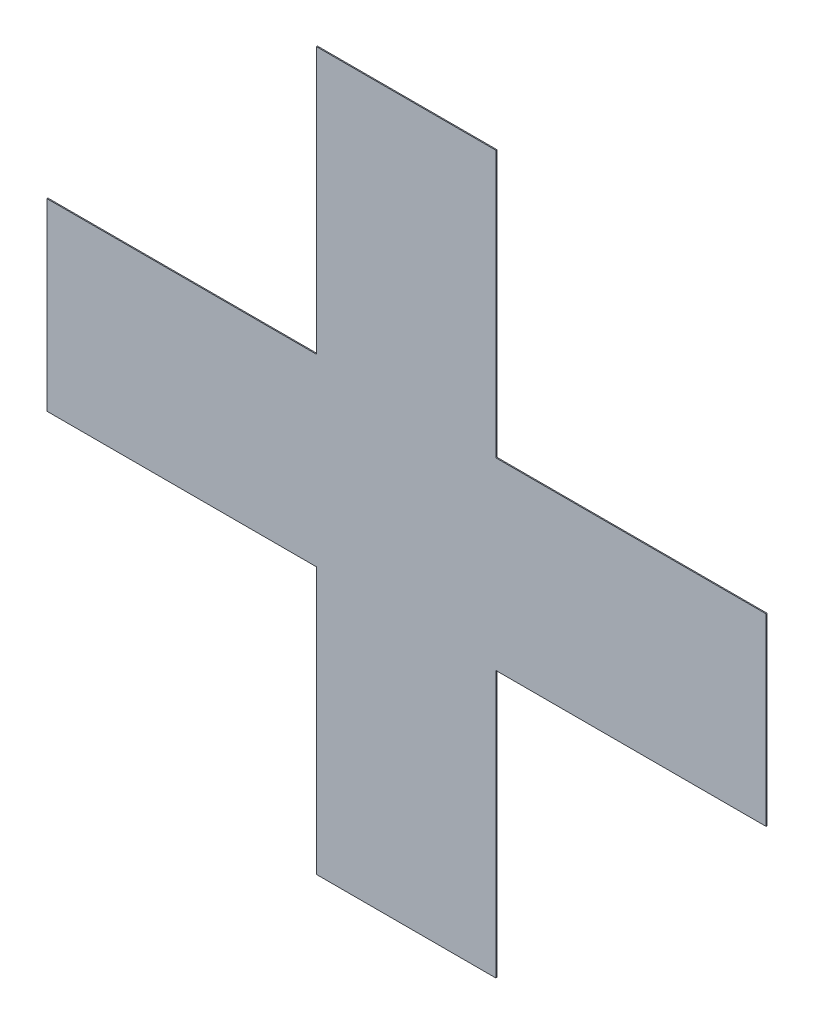
ISO-10303-21;
HEADER;
FILE_DESCRIPTION(('STEP AP214'),'2;1');
FILE_NAME('part.step','',(''),(''),'','','');
FILE_SCHEMA(('AUTOMOTIVE_DESIGN { 1 0 10303 214 1 1 1 1 }'));
ENDSEC;
DATA;
#1=APPLICATION_CONTEXT('core data for automotive mechanical design processes');
#2=APPLICATION_PROTOCOL_DEFINITION('international standard','automotive_design',2000,#1);
#3=PRODUCT_CONTEXT('',#1,'mechanical');
#4=PRODUCT('Part','Part','',(#3));
#5=PRODUCT_RELATED_PRODUCT_CATEGORY('part','',(#4));
#6=PRODUCT_DEFINITION_FORMATION('','',#4);
#7=PRODUCT_DEFINITION_CONTEXT('part definition',#1,'design');
#8=PRODUCT_DEFINITION('design','',#6,#7);
#9=PRODUCT_DEFINITION_SHAPE('','',#8);
#10=(LENGTH_UNIT() NAMED_UNIT(*) SI_UNIT(.MILLI.,.METRE.));
#11=(NAMED_UNIT(*) PLANE_ANGLE_UNIT() SI_UNIT($,.RADIAN.));
#12=(NAMED_UNIT(*) SI_UNIT($,.STERADIAN.) SOLID_ANGLE_UNIT());
#13=UNCERTAINTY_MEASURE_WITH_UNIT(LENGTH_MEASURE(1.E-05),#10,'distance_accuracy_value','');
#14=(GEOMETRIC_REPRESENTATION_CONTEXT(3) GLOBAL_UNCERTAINTY_ASSIGNED_CONTEXT((#13)) GLOBAL_UNIT_ASSIGNED_CONTEXT((#10,
#11,#12)) REPRESENTATION_CONTEXT('',''));
#15=CARTESIAN_POINT('',(0.,0.,0.));
#16=DIRECTION('',(0.,0.,1.));
#17=DIRECTION('',(1.,0.,0.));
#18=AXIS2_PLACEMENT_3D('',#15,#16,#17);
#19=CARTESIAN_POINT('',(-3.49450233484993,6.3894008192784,5.));
#20=DIRECTION('',(0.,-1.,0.));
#21=DIRECTION('',(1.,0.,0.));
#22=AXIS2_PLACEMENT_3D('',#19,#20,#21);
#23=PLANE('',#22);
#24=DIRECTION('',(1.,0.,0.));
#25=VECTOR('',#24,1.);
#26=CARTESIAN_POINT('',(-3.05624013972798,6.3894008192784,5.005));
#27=LINE('',#26,#25);
#28=CARTESIAN_POINT('',(-3.49450233484993,6.3894008192784,5.005));
#29=VERTEX_POINT('',#28);
#30=CARTESIAN_POINT('',(-2.62178892021578,6.3894008192784,5.005));
#31=VERTEX_POINT('',#30);
#32=EDGE_CURVE('E243',#29,#31,#27,.T.);
#33=ORIENTED_EDGE('',*,*,#32,.F.);
#34=DIRECTION('',(0.,0.,1.));
#35=VECTOR('',#34,1.);
#36=CARTESIAN_POINT('',(-3.49450233484993,6.3894008192784,5.0025));
#37=LINE('',#36,#35);
#38=CARTESIAN_POINT('',(-3.49450233484993,6.3894008192784,5.));
#39=VERTEX_POINT('',#38);
#40=EDGE_CURVE('E161',#39,#29,#37,.T.);
#41=ORIENTED_EDGE('',*,*,#40,.F.);
#42=DIRECTION('',(-1.,0.,0.));
#43=VECTOR('',#42,1.);
#44=CARTESIAN_POINT('',(-3.05624013972798,6.3894008192784,5.));
#45=LINE('',#44,#43);
#46=CARTESIAN_POINT('',(-2.62178892021578,6.3894008192784,5.));
#47=VERTEX_POINT('',#46);
#48=EDGE_CURVE('E160',#47,#39,#45,.T.);
#49=ORIENTED_EDGE('',*,*,#48,.F.);
#50=DIRECTION('',(0.,0.,-1.));
#51=VECTOR('',#50,1.);
#52=CARTESIAN_POINT('',(-2.62178892021578,6.3894008192784,5.0025));
#53=LINE('',#52,#51);
#54=EDGE_CURVE('E21',#31,#47,#53,.T.);
#55=ORIENTED_EDGE('',*,*,#54,.F.);
#56=EDGE_LOOP('',(#33,#41,#49,#55));
#57=FACE_BOUND('',#56,.T.);
#58=ADVANCED_FACE('F17',(#57),#23,.T.);
#59=CARTESIAN_POINT('',(-2.62178892021578,6.3894008192784,5.));
#60=DIRECTION('',(1.,0.,0.));
#61=DIRECTION('',(0.,1.,0.));
#62=AXIS2_PLACEMENT_3D('',#59,#60,#61);
#63=PLANE('',#62);
#64=DIRECTION('',(0.,1.,0.));
#65=VECTOR('',#64,1.);
#66=CARTESIAN_POINT('',(-2.62178892021578,8.13292216074182,5.005));
#67=LINE('',#66,#65);
#68=CARTESIAN_POINT('',(-2.62178892021578,7.68513252659547,5.005));
#69=VERTEX_POINT('',#68);
#70=EDGE_CURVE('E155',#31,#69,#67,.T.);
#71=ORIENTED_EDGE('',*,*,#70,.F.);
#72=ORIENTED_EDGE('',*,*,#54,.T.);
#73=DIRECTION('',(0.,-1.,0.));
#74=VECTOR('',#73,1.);
#75=CARTESIAN_POINT('',(-2.62178892021578,8.13292216074182,5.));
#76=LINE('',#75,#74);
#77=CARTESIAN_POINT('',(-2.62178892021578,7.68513252659547,5.));
#78=VERTEX_POINT('',#77);
#79=EDGE_CURVE('E152',#78,#47,#76,.T.);
#80=ORIENTED_EDGE('',*,*,#79,.F.);
#81=DIRECTION('',(0.,0.,-1.));
#82=VECTOR('',#81,1.);
#83=CARTESIAN_POINT('',(-2.62178892021578,7.68513252659547,5.0025));
#84=LINE('',#83,#82);
#85=EDGE_CURVE('E143',#69,#78,#84,.T.);
#86=ORIENTED_EDGE('',*,*,#85,.F.);
#87=EDGE_LOOP('',(#71,#72,#80,#86));
#88=FACE_BOUND('',#87,.T.);
#89=ADVANCED_FACE('F151',(#88),#63,.T.);
#90=CARTESIAN_POINT('',(-2.62178892021578,7.68513252659547,5.));
#91=DIRECTION('',(0.,-1.,0.));
#92=DIRECTION('',(1.,0.,0.));
#93=AXIS2_PLACEMENT_3D('',#90,#91,#92);
#94=PLANE('',#93);
#95=DIRECTION('',(1.,0.,0.));
#96=VECTOR('',#95,1.);
#97=CARTESIAN_POINT('',(-3.05624013972798,7.68513252659547,5.005));
#98=LINE('',#97,#96);
#99=CARTESIAN_POINT('',(-1.30700233484993,7.68513252659547,5.005));
#100=VERTEX_POINT('',#99);
#101=EDGE_CURVE('E202',#69,#100,#98,.T.);
#102=ORIENTED_EDGE('',*,*,#101,.F.);
#103=ORIENTED_EDGE('',*,*,#85,.T.);
#104=DIRECTION('',(-1.,0.,0.));
#105=VECTOR('',#104,1.);
#106=CARTESIAN_POINT('',(-3.05624013972798,7.68513252659547,5.));
#107=LINE('',#106,#105);
#108=CARTESIAN_POINT('',(-1.30700233484993,7.68513252659547,5.));
#109=VERTEX_POINT('',#108);
#110=EDGE_CURVE('E166',#109,#78,#107,.T.);
#111=ORIENTED_EDGE('',*,*,#110,.F.);
#112=DIRECTION('',(0.,0.,-1.));
#113=VECTOR('',#112,1.);
#114=CARTESIAN_POINT('',(-1.30700233484993,7.68513252659547,5.0025));
#115=LINE('',#114,#113);
#116=EDGE_CURVE('E142',#100,#109,#115,.T.);
#117=ORIENTED_EDGE('',*,*,#116,.F.);
#118=EDGE_LOOP('',(#102,#103,#111,#117));
#119=FACE_BOUND('',#118,.T.);
#120=ADVANCED_FACE('F201',(#119),#94,.T.);
#121=CARTESIAN_POINT('',(-1.30700233484993,7.68513252659547,5.));
#122=DIRECTION('',(1.,0.,0.));
#123=DIRECTION('',(0.,1.,0.));
#124=AXIS2_PLACEMENT_3D('',#121,#122,#123);
#125=PLANE('',#124);
#126=DIRECTION('',(0.,1.,0.));
#127=VECTOR('',#126,1.);
#128=CARTESIAN_POINT('',(-1.30700233484993,8.13292216074182,5.005));
#129=LINE('',#128,#127);
#130=CARTESIAN_POINT('',(-1.30700233484993,8.58071179488816,5.005));
#131=VERTEX_POINT('',#130);
#132=EDGE_CURVE('E199',#100,#131,#129,.T.);
#133=ORIENTED_EDGE('',*,*,#132,.F.);
#134=ORIENTED_EDGE('',*,*,#116,.T.);
#135=DIRECTION('',(0.,-1.,0.));
#136=VECTOR('',#135,1.);
#137=CARTESIAN_POINT('',(-1.30700233484993,8.13292216074182,5.));
#138=LINE('',#137,#136);
#139=CARTESIAN_POINT('',(-1.30700233484993,8.58071179488816,5.));
#140=VERTEX_POINT('',#139);
#141=EDGE_CURVE('E168',#140,#109,#138,.T.);
#142=ORIENTED_EDGE('',*,*,#141,.F.);
#143=DIRECTION('',(0.,0.,-1.));
#144=VECTOR('',#143,1.);
#145=CARTESIAN_POINT('',(-1.30700233484993,8.58071179488816,5.0025));
#146=LINE('',#145,#144);
#147=EDGE_CURVE('E140',#131,#140,#146,.T.);
#148=ORIENTED_EDGE('',*,*,#147,.F.);
#149=EDGE_LOOP('',(#133,#134,#142,#148));
#150=FACE_BOUND('',#149,.T.);
#151=ADVANCED_FACE('F197',(#150),#125,.T.);
#152=CARTESIAN_POINT('',(-1.30700233484993,8.58071179488816,5.));
#153=DIRECTION('',(0.,1.,0.));
#154=DIRECTION('',(-1.,0.,0.));
#155=AXIS2_PLACEMENT_3D('',#152,#153,#154);
#156=PLANE('',#155);
#157=DIRECTION('',(-1.,0.,0.));
#158=VECTOR('',#157,1.);
#159=CARTESIAN_POINT('',(-3.05624013972798,8.58071179488816,5.005));
#160=LINE('',#159,#158);
#161=CARTESIAN_POINT('',(-2.62178892021578,8.58071179488816,5.005));
#162=VERTEX_POINT('',#161);
#163=EDGE_CURVE('E238',#131,#162,#160,.T.);
#164=ORIENTED_EDGE('',*,*,#163,.F.);
#165=ORIENTED_EDGE('',*,*,#147,.T.);
#166=DIRECTION('',(1.,0.,0.));
#167=VECTOR('',#166,1.);
#168=CARTESIAN_POINT('',(-3.05624013972798,8.58071179488816,5.));
#169=LINE('',#168,#167);
#170=CARTESIAN_POINT('',(-2.62178892021578,8.58071179488816,5.));
#171=VERTEX_POINT('',#170);
#172=EDGE_CURVE('E173',#171,#140,#169,.T.);
#173=ORIENTED_EDGE('',*,*,#172,.F.);
#174=DIRECTION('',(0.,0.,-1.));
#175=VECTOR('',#174,1.);
#176=CARTESIAN_POINT('',(-2.62178892021578,8.58071179488816,5.0025));
#177=LINE('',#176,#175);
#178=EDGE_CURVE('E138',#162,#171,#177,.T.);
#179=ORIENTED_EDGE('',*,*,#178,.F.);
#180=EDGE_LOOP('',(#164,#165,#173,#179));
#181=FACE_BOUND('',#180,.T.);
#182=ADVANCED_FACE('F193',(#181),#156,.T.);
#183=CARTESIAN_POINT('',(-2.62178892021578,8.58071179488816,5.));
#184=DIRECTION('',(1.,0.,0.));
#185=DIRECTION('',(0.,1.,0.));
#186=AXIS2_PLACEMENT_3D('',#183,#184,#185);
#187=PLANE('',#186);
#188=DIRECTION('',(0.,1.,0.));
#189=VECTOR('',#188,1.);
#190=CARTESIAN_POINT('',(-2.62178892021578,8.13292216074182,5.005));
#191=LINE('',#190,#189);
#192=CARTESIAN_POINT('',(-2.62178892021578,9.87644350220523,5.005));
#193=VERTEX_POINT('',#192);
#194=EDGE_CURVE('E189',#162,#193,#191,.T.);
#195=ORIENTED_EDGE('',*,*,#194,.F.);
#196=ORIENTED_EDGE('',*,*,#178,.T.);
#197=DIRECTION('',(0.,-1.,0.));
#198=VECTOR('',#197,1.);
#199=CARTESIAN_POINT('',(-2.62178892021578,8.13292216074182,5.));
#200=LINE('',#199,#198);
#201=CARTESIAN_POINT('',(-2.62178892021578,9.87644350220523,5.));
#202=VERTEX_POINT('',#201);
#203=EDGE_CURVE('E176',#202,#171,#200,.T.);
#204=ORIENTED_EDGE('',*,*,#203,.F.);
#205=DIRECTION('',(0.,0.,-1.));
#206=VECTOR('',#205,1.);
#207=CARTESIAN_POINT('',(-2.62178892021578,9.87644350220523,5.0025));
#208=LINE('',#207,#206);
#209=EDGE_CURVE('E136',#193,#202,#208,.T.);
#210=ORIENTED_EDGE('',*,*,#209,.F.);
#211=EDGE_LOOP('',(#195,#196,#204,#210));
#212=FACE_BOUND('',#211,.T.);
#213=ADVANCED_FACE('F187',(#212),#187,.T.);
#214=CARTESIAN_POINT('',(-2.62178892021578,9.87644350220523,5.));
#215=DIRECTION('',(0.,1.,0.));
#216=DIRECTION('',(-1.,0.,0.));
#217=AXIS2_PLACEMENT_3D('',#214,#215,#216);
#218=PLANE('',#217);
#219=DIRECTION('',(-1.,0.,0.));
#220=VECTOR('',#219,1.);
#221=CARTESIAN_POINT('',(-3.05624013972798,9.87644350220523,5.005));
#222=LINE('',#221,#220);
#223=CARTESIAN_POINT('',(-3.49450233484993,9.87644350220523,5.005));
#224=VERTEX_POINT('',#223);
#225=EDGE_CURVE('E183',#193,#224,#222,.T.);
#226=ORIENTED_EDGE('',*,*,#225,.F.);
#227=ORIENTED_EDGE('',*,*,#209,.T.);
#228=DIRECTION('',(1.,0.,0.));
#229=VECTOR('',#228,1.);
#230=CARTESIAN_POINT('',(-3.05624013972798,9.87644350220523,5.));
#231=LINE('',#230,#229);
#232=CARTESIAN_POINT('',(-3.49450233484993,9.87644350220523,5.));
#233=VERTEX_POINT('',#232);
#234=EDGE_CURVE('E125',#233,#202,#231,.T.);
#235=ORIENTED_EDGE('',*,*,#234,.F.);
#236=DIRECTION('',(0.,0.,-1.));
#237=VECTOR('',#236,1.);
#238=CARTESIAN_POINT('',(-3.49450233484993,9.87644350220523,5.0025));
#239=LINE('',#238,#237);
#240=EDGE_CURVE('E105',#224,#233,#239,.T.);
#241=ORIENTED_EDGE('',*,*,#240,.F.);
#242=EDGE_LOOP('',(#226,#227,#235,#241));
#243=FACE_BOUND('',#242,.T.);
#244=ADVANCED_FACE('F181',(#243),#218,.T.);
#245=CARTESIAN_POINT('',(-3.49450233484993,9.87644350220523,5.));
#246=DIRECTION('',(-1.,0.,0.));
#247=DIRECTION('',(0.,-1.,0.));
#248=AXIS2_PLACEMENT_3D('',#245,#246,#247);
#249=PLANE('',#248);
#250=DIRECTION('',(0.,-1.,0.));
#251=VECTOR('',#250,1.);
#252=CARTESIAN_POINT('',(-3.49450233484993,8.13292216074182,5.005));
#253=LINE('',#252,#251);
#254=CARTESIAN_POINT('',(-3.49450233484993,8.58071179488815,5.005));
#255=VERTEX_POINT('',#254);
#256=EDGE_CURVE('E234',#224,#255,#253,.T.);
#257=ORIENTED_EDGE('',*,*,#256,.F.);
#258=ORIENTED_EDGE('',*,*,#240,.T.);
#259=DIRECTION('',(0.,1.,0.));
#260=VECTOR('',#259,1.);
#261=CARTESIAN_POINT('',(-3.49450233484993,8.13292216074182,5.));
#262=LINE('',#261,#260);
#263=CARTESIAN_POINT('',(-3.49450233484993,8.58071179488816,5.));
#264=VERTEX_POINT('',#263);
#265=EDGE_CURVE('E121',#264,#233,#262,.T.);
#266=ORIENTED_EDGE('',*,*,#265,.F.);
#267=DIRECTION('',(0.,0.,-1.));
#268=VECTOR('',#267,1.);
#269=CARTESIAN_POINT('',(-3.49450233484993,8.58071179488816,5.0025));
#270=LINE('',#269,#268);
#271=EDGE_CURVE('E111',#255,#264,#270,.T.);
#272=ORIENTED_EDGE('',*,*,#271,.F.);
#273=EDGE_LOOP('',(#257,#258,#266,#272));
#274=FACE_BOUND('',#273,.T.);
#275=ADVANCED_FACE('F122',(#274),#249,.T.);
#276=CARTESIAN_POINT('',(-3.49450233484993,8.58071179488816,5.));
#277=DIRECTION('',(0.,1.,0.));
#278=DIRECTION('',(-1.,0.,0.));
#279=AXIS2_PLACEMENT_3D('',#276,#277,#278);
#280=PLANE('',#279);
#281=DIRECTION('',(-1.,0.,0.));
#282=VECTOR('',#281,1.);
#283=CARTESIAN_POINT('',(-3.05624013972798,8.58071179488816,5.005));
#284=LINE('',#283,#282);
#285=CARTESIAN_POINT('',(-4.80547794460603,8.58071179488816,5.005));
#286=VERTEX_POINT('',#285);
#287=EDGE_CURVE('E116',#255,#286,#284,.T.);
#288=ORIENTED_EDGE('',*,*,#287,.F.);
#289=ORIENTED_EDGE('',*,*,#271,.T.);
#290=DIRECTION('',(1.,0.,0.));
#291=VECTOR('',#290,1.);
#292=CARTESIAN_POINT('',(-3.05624013972798,8.58071179488816,5.));
#293=LINE('',#292,#291);
#294=CARTESIAN_POINT('',(-4.80547794460603,8.58071179488816,5.));
#295=VERTEX_POINT('',#294);
#296=EDGE_CURVE('E114',#295,#264,#293,.T.);
#297=ORIENTED_EDGE('',*,*,#296,.F.);
#298=DIRECTION('',(0.,0.,1.));
#299=VECTOR('',#298,1.);
#300=CARTESIAN_POINT('',(-4.80547794460603,8.58071179488816,5.0025));
#301=LINE('',#300,#299);
#302=EDGE_CURVE('E118',#295,#286,#301,.T.);
#303=ORIENTED_EDGE('',*,*,#302,.T.);
#304=EDGE_LOOP('',(#288,#289,#297,#303));
#305=FACE_BOUND('',#304,.T.);
#306=ADVANCED_FACE('F112',(#305),#280,.T.);
#307=CARTESIAN_POINT('',(-1.30700233484993,6.3894008192784,5.));
#308=DIRECTION('',(0.,0.,-1.));
#309=DIRECTION('',(-1.,0.,0.));
#310=AXIS2_PLACEMENT_3D('',#307,#308,#309);
#311=PLANE('',#310);
#312=ORIENTED_EDGE('',*,*,#79,.T.);
#313=ORIENTED_EDGE('',*,*,#48,.T.);
#314=DIRECTION('',(0.,-1.,0.));
#315=VECTOR('',#314,1.);
#316=CARTESIAN_POINT('',(-3.49450233484993,7.03726667293693,5.));
#317=LINE('',#316,#315);
#318=CARTESIAN_POINT('',(-3.49450233484993,7.68513252659547,5.));
#319=VERTEX_POINT('',#318);
#320=EDGE_CURVE('E163',#319,#39,#317,.T.);
#321=ORIENTED_EDGE('',*,*,#320,.F.);
#322=DIRECTION('',(1.,0.,0.));
#323=VECTOR('',#322,1.);
#324=CARTESIAN_POINT('',(-4.14999013972798,7.68513252659547,5.));
#325=LINE('',#324,#323);
#326=CARTESIAN_POINT('',(-4.80547794460603,7.68513252659547,5.));
#327=VERTEX_POINT('',#326);
#328=EDGE_CURVE('E227',#327,#319,#325,.T.);
#329=ORIENTED_EDGE('',*,*,#328,.F.);
#330=DIRECTION('',(0.,-1.,0.));
#331=VECTOR('',#330,1.);
#332=CARTESIAN_POINT('',(-4.80547794460603,8.13292216074182,5.));
#333=LINE('',#332,#331);
#334=EDGE_CURVE('E130',#295,#327,#333,.T.);
#335=ORIENTED_EDGE('',*,*,#334,.F.);
#336=ORIENTED_EDGE('',*,*,#296,.T.);
#337=ORIENTED_EDGE('',*,*,#265,.T.);
#338=ORIENTED_EDGE('',*,*,#234,.T.);
#339=ORIENTED_EDGE('',*,*,#203,.T.);
#340=ORIENTED_EDGE('',*,*,#172,.T.);
#341=ORIENTED_EDGE('',*,*,#141,.T.);
#342=ORIENTED_EDGE('',*,*,#110,.T.);
#343=EDGE_LOOP('',(#312,#313,#321,#329,#335,#336,#337,#338,#339,#340,#341,#342));
#344=FACE_BOUND('',#343,.T.);
#345=ADVANCED_FACE('F128',(#344),#311,.T.);
#346=CARTESIAN_POINT('',(-3.49450233484993,7.68513252659547,5.));
#347=DIRECTION('',(-1.,0.,0.));
#348=DIRECTION('',(0.,-1.,0.));
#349=AXIS2_PLACEMENT_3D('',#346,#347,#348);
#350=PLANE('',#349);
#351=DIRECTION('',(0.,-1.,0.));
#352=VECTOR('',#351,1.);
#353=CARTESIAN_POINT('',(-3.49450233484993,8.13292216074182,5.005));
#354=LINE('',#353,#352);
#355=CARTESIAN_POINT('',(-3.49450233484993,7.68513252659547,5.005));
#356=VERTEX_POINT('',#355);
#357=EDGE_CURVE('E245',#356,#29,#354,.T.);
#358=ORIENTED_EDGE('',*,*,#357,.F.);
#359=DIRECTION('',(0.,0.,1.));
#360=VECTOR('',#359,1.);
#361=CARTESIAN_POINT('',(-3.49450233484993,7.68513252659547,5.0025));
#362=LINE('',#361,#360);
#363=EDGE_CURVE('E224',#319,#356,#362,.T.);
#364=ORIENTED_EDGE('',*,*,#363,.F.);
#365=ORIENTED_EDGE('',*,*,#320,.T.);
#366=ORIENTED_EDGE('',*,*,#40,.T.);
#367=EDGE_LOOP('',(#358,#364,#365,#366));
#368=FACE_BOUND('',#367,.T.);
#369=ADVANCED_FACE('F248',(#368),#350,.T.);
#370=CARTESIAN_POINT('',(-4.80547794460603,6.3894008192784,5.005));
#371=DIRECTION('',(0.,0.,1.));
#372=DIRECTION('',(1.,0.,0.));
#373=AXIS2_PLACEMENT_3D('',#370,#371,#372);
#374=PLANE('',#373);
#375=DIRECTION('',(0.,1.,0.));
#376=VECTOR('',#375,1.);
#377=CARTESIAN_POINT('',(-4.80547794460603,8.13292216074182,5.005));
#378=LINE('',#377,#376);
#379=CARTESIAN_POINT('',(-4.80547794460603,7.68513252659547,5.005));
#380=VERTEX_POINT('',#379);
#381=EDGE_CURVE('E36',#380,#286,#378,.T.);
#382=ORIENTED_EDGE('',*,*,#381,.F.);
#383=DIRECTION('',(-1.,0.,0.));
#384=VECTOR('',#383,1.);
#385=CARTESIAN_POINT('',(-4.14999013972798,7.68513252659547,5.005));
#386=LINE('',#385,#384);
#387=EDGE_CURVE('E27',#356,#380,#386,.T.);
#388=ORIENTED_EDGE('',*,*,#387,.F.);
#389=ORIENTED_EDGE('',*,*,#357,.T.);
#390=ORIENTED_EDGE('',*,*,#32,.T.);
#391=ORIENTED_EDGE('',*,*,#70,.T.);
#392=ORIENTED_EDGE('',*,*,#101,.T.);
#393=ORIENTED_EDGE('',*,*,#132,.T.);
#394=ORIENTED_EDGE('',*,*,#163,.T.);
#395=ORIENTED_EDGE('',*,*,#194,.T.);
#396=ORIENTED_EDGE('',*,*,#225,.T.);
#397=ORIENTED_EDGE('',*,*,#256,.T.);
#398=ORIENTED_EDGE('',*,*,#287,.T.);
#399=EDGE_LOOP('',(#382,#388,#389,#390,#391,#392,#393,#394,#395,#396,#397,#398));
#400=FACE_BOUND('',#399,.T.);
#401=ADVANCED_FACE('F218',(#400),#374,.T.);
#402=CARTESIAN_POINT('',(-4.80547794460603,8.58071179488816,5.));
#403=DIRECTION('',(-1.,0.,0.));
#404=DIRECTION('',(0.,-1.,0.));
#405=AXIS2_PLACEMENT_3D('',#402,#403,#404);
#406=PLANE('',#405);
#407=ORIENTED_EDGE('',*,*,#381,.T.);
#408=ORIENTED_EDGE('',*,*,#302,.F.);
#409=ORIENTED_EDGE('',*,*,#334,.T.);
#410=DIRECTION('',(0.,0.,-1.));
#411=VECTOR('',#410,1.);
#412=CARTESIAN_POINT('',(-4.80547794460603,7.68513252659547,5.0025));
#413=LINE('',#412,#411);
#414=EDGE_CURVE('E11',#380,#327,#413,.T.);
#415=ORIENTED_EDGE('',*,*,#414,.F.);
#416=EDGE_LOOP('',(#407,#408,#409,#415));
#417=FACE_BOUND('',#416,.T.);
#418=ADVANCED_FACE('F213',(#417),#406,.T.);
#419=CARTESIAN_POINT('',(-4.80547794460603,7.68513252659547,5.));
#420=DIRECTION('',(0.,-1.,0.));
#421=DIRECTION('',(1.,0.,0.));
#422=AXIS2_PLACEMENT_3D('',#419,#420,#421);
#423=PLANE('',#422);
#424=ORIENTED_EDGE('',*,*,#387,.T.);
#425=ORIENTED_EDGE('',*,*,#414,.T.);
#426=ORIENTED_EDGE('',*,*,#328,.T.);
#427=ORIENTED_EDGE('',*,*,#363,.T.);
#428=EDGE_LOOP('',(#424,#425,#426,#427));
#429=FACE_BOUND('',#428,.T.);
#430=ADVANCED_FACE('F19',(#429),#423,.T.);
#431=CLOSED_SHELL('',(#58,#89,#120,#151,#182,#213,#244,#275,#306,#345,#369,#401,#418,#430));
#432=MANIFOLD_SOLID_BREP('B1',#431);
#433=ADVANCED_BREP_SHAPE_REPRESENTATION('',(#18,#432),#14);
#434=SHAPE_DEFINITION_REPRESENTATION(#9,#433);
ENDSEC;
END-ISO-10303-21;
